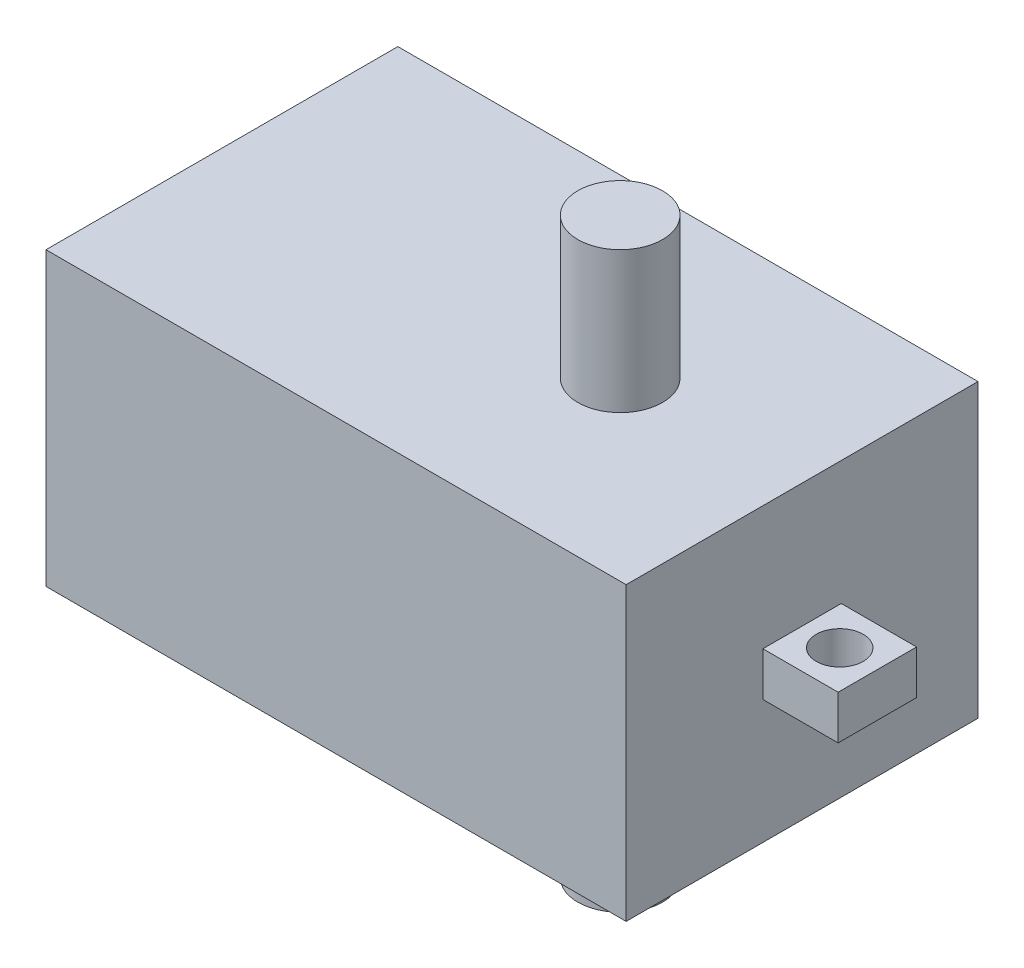
ISO-10303-21;
HEADER;
FILE_DESCRIPTION(('STEP AP214'),'2;1');
FILE_NAME('part.step','',(''),(''),'','','');
FILE_SCHEMA(('AUTOMOTIVE_DESIGN { 1 0 10303 214 1 1 1 1 }'));
ENDSEC;
DATA;
#1=APPLICATION_CONTEXT('core data for automotive mechanical design processes');
#2=APPLICATION_PROTOCOL_DEFINITION('international standard','automotive_design',2000,#1);
#3=PRODUCT_CONTEXT('',#1,'mechanical');
#4=PRODUCT('Part','Part','',(#3));
#5=PRODUCT_RELATED_PRODUCT_CATEGORY('part','',(#4));
#6=PRODUCT_DEFINITION_FORMATION('','',#4);
#7=PRODUCT_DEFINITION_CONTEXT('part definition',#1,'design');
#8=PRODUCT_DEFINITION('design','',#6,#7);
#9=PRODUCT_DEFINITION_SHAPE('','',#8);
#10=(LENGTH_UNIT() NAMED_UNIT(*) SI_UNIT(.MILLI.,.METRE.));
#11=(NAMED_UNIT(*) PLANE_ANGLE_UNIT() SI_UNIT($,.RADIAN.));
#12=(NAMED_UNIT(*) SI_UNIT($,.STERADIAN.) SOLID_ANGLE_UNIT());
#13=UNCERTAINTY_MEASURE_WITH_UNIT(LENGTH_MEASURE(1.E-05),#10,'distance_accuracy_value','');
#14=(GEOMETRIC_REPRESENTATION_CONTEXT(3) GLOBAL_UNCERTAINTY_ASSIGNED_CONTEXT((#13)) GLOBAL_UNIT_ASSIGNED_CONTEXT((#10,
#11,#12)) REPRESENTATION_CONTEXT('',''));
#15=CARTESIAN_POINT('',(0.,0.,0.));
#16=DIRECTION('',(0.,0.,1.));
#17=DIRECTION('',(1.,0.,0.));
#18=AXIS2_PLACEMENT_3D('',#15,#16,#17);
#19=CARTESIAN_POINT('',(18.5,-9.3,22.44));
#20=DIRECTION('',(-1.,0.,0.));
#21=DIRECTION('',(0.,0.,1.));
#22=AXIS2_PLACEMENT_3D('',#19,#20,#21);
#23=PLANE('',#22);
#24=DIRECTION('',(0.,1.,0.));
#25=VECTOR('',#24,1.);
#26=CARTESIAN_POINT('',(18.5,-9.3,0.));
#27=LINE('',#26,#25);
#28=CARTESIAN_POINT('',(18.5,-9.3,0.));
#29=VERTEX_POINT('',#28);
#30=CARTESIAN_POINT('',(18.5,9.3,0.));
#31=VERTEX_POINT('',#30);
#32=EDGE_CURVE('E156',#29,#31,#27,.T.);
#33=ORIENTED_EDGE('',*,*,#32,.T.);
#34=DIRECTION('',(0.,0.,-1.));
#35=VECTOR('',#34,1.);
#36=CARTESIAN_POINT('',(18.5,9.3,22.44));
#37=LINE('',#36,#35);
#38=CARTESIAN_POINT('',(18.5,9.3,22.44));
#39=VERTEX_POINT('',#38);
#40=EDGE_CURVE('E164',#39,#31,#37,.T.);
#41=ORIENTED_EDGE('',*,*,#40,.F.);
#42=DIRECTION('',(0.,1.,0.));
#43=VECTOR('',#42,1.);
#44=CARTESIAN_POINT('',(18.5,-9.3,22.44));
#45=LINE('',#44,#43);
#46=CARTESIAN_POINT('',(18.5,-9.3,22.44));
#47=VERTEX_POINT('',#46);
#48=EDGE_CURVE('E147',#47,#39,#45,.T.);
#49=ORIENTED_EDGE('',*,*,#48,.F.);
#50=DIRECTION('',(0.,0.,-1.));
#51=VECTOR('',#50,1.);
#52=CARTESIAN_POINT('',(18.5,-9.3,22.44));
#53=LINE('',#52,#51);
#54=EDGE_CURVE('E168',#47,#29,#53,.T.);
#55=ORIENTED_EDGE('',*,*,#54,.T.);
#56=EDGE_LOOP('',(#33,#41,#49,#55));
#57=FACE_BOUND('',#56,.T.);
#58=DIRECTION('',(0.,-1.,0.));
#59=VECTOR('',#58,1.);
#60=CARTESIAN_POINT('',(18.5,-1.4,13.72));
#61=LINE('',#60,#59);
#62=CARTESIAN_POINT('',(18.5,1.4,13.72));
#63=VERTEX_POINT('',#62);
#64=CARTESIAN_POINT('',(18.5,-1.4,13.72));
#65=VERTEX_POINT('',#64);
#66=EDGE_CURVE('E55',#63,#65,#61,.T.);
#67=ORIENTED_EDGE('',*,*,#66,.F.);
#68=DIRECTION('',(0.,0.,1.));
#69=VECTOR('',#68,1.);
#70=CARTESIAN_POINT('',(18.5,1.4,8.72));
#71=LINE('',#70,#69);
#72=CARTESIAN_POINT('',(18.5,1.4,8.72));
#73=VERTEX_POINT('',#72);
#74=EDGE_CURVE('E59',#73,#63,#71,.T.);
#75=ORIENTED_EDGE('',*,*,#74,.F.);
#76=DIRECTION('',(0.,1.,0.));
#77=VECTOR('',#76,1.);
#78=CARTESIAN_POINT('',(18.5,-1.4,8.72));
#79=LINE('',#78,#77);
#80=CARTESIAN_POINT('',(18.5,-1.4,8.72));
#81=VERTEX_POINT('',#80);
#82=EDGE_CURVE('E250',#81,#73,#79,.T.);
#83=ORIENTED_EDGE('',*,*,#82,.F.);
#84=DIRECTION('',(0.,0.,-1.));
#85=VECTOR('',#84,1.);
#86=CARTESIAN_POINT('',(18.5,-1.4,8.72));
#87=LINE('',#86,#85);
#88=EDGE_CURVE('E247',#65,#81,#87,.T.);
#89=ORIENTED_EDGE('',*,*,#88,.F.);
#90=EDGE_LOOP('',(#67,#75,#83,#89));
#91=FACE_BOUND('',#90,.T.);
#92=ADVANCED_FACE('F39',(#57,#91),#23,.F.);
#93=CARTESIAN_POINT('',(-18.5,-9.3,22.44));
#94=DIRECTION('',(1.,0.,0.));
#95=DIRECTION('',(0.,0.,-1.));
#96=AXIS2_PLACEMENT_3D('',#93,#94,#95);
#97=PLANE('',#96);
#98=DIRECTION('',(0.,-1.,0.));
#99=VECTOR('',#98,1.);
#100=CARTESIAN_POINT('',(-18.5,-9.3,0.));
#101=LINE('',#100,#99);
#102=CARTESIAN_POINT('',(-18.5,9.3,0.));
#103=VERTEX_POINT('',#102);
#104=CARTESIAN_POINT('',(-18.5,-9.3,0.));
#105=VERTEX_POINT('',#104);
#106=EDGE_CURVE('E128',#103,#105,#101,.T.);
#107=ORIENTED_EDGE('',*,*,#106,.T.);
#108=DIRECTION('',(0.,0.,-1.));
#109=VECTOR('',#108,1.);
#110=CARTESIAN_POINT('',(-18.5,-9.3,22.44));
#111=LINE('',#110,#109);
#112=CARTESIAN_POINT('',(-18.5,-9.3,22.44));
#113=VERTEX_POINT('',#112);
#114=EDGE_CURVE('E48',#113,#105,#111,.T.);
#115=ORIENTED_EDGE('',*,*,#114,.F.);
#116=DIRECTION('',(0.,-1.,0.));
#117=VECTOR('',#116,1.);
#118=CARTESIAN_POINT('',(-18.5,-9.3,22.44));
#119=LINE('',#118,#117);
#120=CARTESIAN_POINT('',(-18.5,9.3,22.44));
#121=VERTEX_POINT('',#120);
#122=EDGE_CURVE('E139',#121,#113,#119,.T.);
#123=ORIENTED_EDGE('',*,*,#122,.F.);
#124=DIRECTION('',(0.,0.,-1.));
#125=VECTOR('',#124,1.);
#126=CARTESIAN_POINT('',(-18.5,9.3,22.44));
#127=LINE('',#126,#125);
#128=EDGE_CURVE('E152',#121,#103,#127,.T.);
#129=ORIENTED_EDGE('',*,*,#128,.T.);
#130=EDGE_LOOP('',(#107,#115,#123,#129));
#131=FACE_BOUND('',#130,.T.);
#132=ADVANCED_FACE('F41',(#131),#97,.F.);
#133=CARTESIAN_POINT('',(18.5,-9.3,22.44));
#134=DIRECTION('',(0.,1.,0.));
#135=DIRECTION('',(-1.,0.,0.));
#136=AXIS2_PLACEMENT_3D('',#133,#134,#135);
#137=PLANE('',#136);
#138=CARTESIAN_POINT('',(6.9,-9.3,11.22));
#139=DIRECTION('',(0.,1.,0.));
#140=DIRECTION('',(-1.,0.,0.));
#141=AXIS2_PLACEMENT_3D('',#138,#139,#140);
#142=CIRCLE('',#141,2.7);
#143=CARTESIAN_POINT('',(4.2,-9.3,11.22));
#144=VERTEX_POINT('',#143);
#145=EDGE_CURVE('E219',#144,#144,#142,.T.);
#146=ORIENTED_EDGE('',*,*,#145,.T.);
#147=EDGE_LOOP('',(#146));
#148=FACE_BOUND('',#147,.T.);
#149=DIRECTION('',(1.,0.,0.));
#150=VECTOR('',#149,1.);
#151=CARTESIAN_POINT('',(18.5,-9.3,0.));
#152=LINE('',#151,#150);
#153=EDGE_CURVE('E133',#105,#29,#152,.T.);
#154=ORIENTED_EDGE('',*,*,#153,.T.);
#155=ORIENTED_EDGE('',*,*,#54,.F.);
#156=DIRECTION('',(1.,0.,0.));
#157=VECTOR('',#156,1.);
#158=CARTESIAN_POINT('',(18.5,-9.3,22.44));
#159=LINE('',#158,#157);
#160=EDGE_CURVE('E143',#113,#47,#159,.T.);
#161=ORIENTED_EDGE('',*,*,#160,.F.);
#162=ORIENTED_EDGE('',*,*,#114,.T.);
#163=EDGE_LOOP('',(#154,#155,#161,#162));
#164=FACE_BOUND('',#163,.T.);
#165=ADVANCED_FACE('F175',(#148,#164),#137,.F.);
#166=CARTESIAN_POINT('',(18.5,9.3,22.44));
#167=DIRECTION('',(0.,-1.,0.));
#168=DIRECTION('',(1.,0.,0.));
#169=AXIS2_PLACEMENT_3D('',#166,#167,#168);
#170=PLANE('',#169);
#171=CARTESIAN_POINT('',(6.9,9.3,11.22));
#172=DIRECTION('',(0.,-1.,0.));
#173=DIRECTION('',(1.,0.,0.));
#174=AXIS2_PLACEMENT_3D('',#171,#172,#173);
#175=CIRCLE('',#174,2.7);
#176=CARTESIAN_POINT('',(9.6,9.3,11.22));
#177=VERTEX_POINT('',#176);
#178=EDGE_CURVE('E11',#177,#177,#175,.F.);
#179=ORIENTED_EDGE('',*,*,#178,.F.);
#180=EDGE_LOOP('',(#179));
#181=FACE_BOUND('',#180,.T.);
#182=DIRECTION('',(-1.,0.,0.));
#183=VECTOR('',#182,1.);
#184=CARTESIAN_POINT('',(18.5,9.3,0.));
#185=LINE('',#184,#183);
#186=EDGE_CURVE('E144',#31,#103,#185,.T.);
#187=ORIENTED_EDGE('',*,*,#186,.T.);
#188=ORIENTED_EDGE('',*,*,#128,.F.);
#189=DIRECTION('',(-1.,0.,0.));
#190=VECTOR('',#189,1.);
#191=CARTESIAN_POINT('',(18.5,9.3,22.44));
#192=LINE('',#191,#190);
#193=EDGE_CURVE('E150',#39,#121,#192,.T.);
#194=ORIENTED_EDGE('',*,*,#193,.F.);
#195=ORIENTED_EDGE('',*,*,#40,.T.);
#196=EDGE_LOOP('',(#187,#188,#194,#195));
#197=FACE_BOUND('',#196,.T.);
#198=ADVANCED_FACE('F190',(#181,#197),#170,.F.);
#199=CARTESIAN_POINT('',(0.,0.,22.44));
#200=DIRECTION('',(0.,0.,1.));
#201=DIRECTION('',(1.,0.,0.));
#202=AXIS2_PLACEMENT_3D('',#199,#200,#201);
#203=PLANE('',#202);
#204=ORIENTED_EDGE('',*,*,#122,.T.);
#205=ORIENTED_EDGE('',*,*,#160,.T.);
#206=ORIENTED_EDGE('',*,*,#48,.T.);
#207=ORIENTED_EDGE('',*,*,#193,.T.);
#208=EDGE_LOOP('',(#204,#205,#206,#207));
#209=FACE_BOUND('',#208,.T.);
#210=ADVANCED_FACE('F192',(#209),#203,.T.);
#211=CARTESIAN_POINT('',(0.,0.,0.));
#212=DIRECTION('',(0.,0.,1.));
#213=DIRECTION('',(1.,0.,0.));
#214=AXIS2_PLACEMENT_3D('',#211,#212,#213);
#215=PLANE('',#214);
#216=ORIENTED_EDGE('',*,*,#106,.F.);
#217=ORIENTED_EDGE('',*,*,#186,.F.);
#218=ORIENTED_EDGE('',*,*,#32,.F.);
#219=ORIENTED_EDGE('',*,*,#153,.F.);
#220=EDGE_LOOP('',(#216,#217,#218,#219));
#221=FACE_BOUND('',#220,.T.);
#222=ADVANCED_FACE('F183',(#221),#215,.F.);
#223=CARTESIAN_POINT('',(23.3,-1.4,13.72));
#224=DIRECTION('',(0.,0.,-1.));
#225=DIRECTION('',(-1.,0.,0.));
#226=AXIS2_PLACEMENT_3D('',#223,#224,#225);
#227=PLANE('',#226);
#228=ORIENTED_EDGE('',*,*,#66,.T.);
#229=DIRECTION('',(-1.,0.,0.));
#230=VECTOR('',#229,1.);
#231=CARTESIAN_POINT('',(23.3,-1.4,13.72));
#232=LINE('',#231,#230);
#233=CARTESIAN_POINT('',(23.3,-1.4,13.72));
#234=VERTEX_POINT('',#233);
#235=EDGE_CURVE('E108',#234,#65,#232,.T.);
#236=ORIENTED_EDGE('',*,*,#235,.F.);
#237=DIRECTION('',(0.,-1.,0.));
#238=VECTOR('',#237,1.);
#239=CARTESIAN_POINT('',(23.3,-1.4,13.72));
#240=LINE('',#239,#238);
#241=CARTESIAN_POINT('',(23.3,1.4,13.72));
#242=VERTEX_POINT('',#241);
#243=EDGE_CURVE('E115',#242,#234,#240,.T.);
#244=ORIENTED_EDGE('',*,*,#243,.F.);
#245=DIRECTION('',(-1.,0.,0.));
#246=VECTOR('',#245,1.);
#247=CARTESIAN_POINT('',(23.3,1.4,13.72));
#248=LINE('',#247,#246);
#249=EDGE_CURVE('E244',#242,#63,#248,.T.);
#250=ORIENTED_EDGE('',*,*,#249,.T.);
#251=EDGE_LOOP('',(#228,#236,#244,#250));
#252=FACE_BOUND('',#251,.T.);
#253=ADVANCED_FACE('F126',(#252),#227,.F.);
#254=CARTESIAN_POINT('',(23.3,-1.4,8.72));
#255=DIRECTION('',(0.,1.,0.));
#256=DIRECTION('',(0.,0.,1.));
#257=AXIS2_PLACEMENT_3D('',#254,#255,#256);
#258=PLANE('',#257);
#259=CARTESIAN_POINT('',(20.9,-1.4,11.22));
#260=DIRECTION('',(0.,1.,0.));
#261=DIRECTION('',(0.,0.,1.));
#262=AXIS2_PLACEMENT_3D('',#259,#260,#261);
#263=CIRCLE('',#262,1.5);
#264=CARTESIAN_POINT('',(20.9,-1.4,12.72));
#265=VERTEX_POINT('',#264);
#266=EDGE_CURVE('E236',#265,#265,#263,.F.);
#267=ORIENTED_EDGE('',*,*,#266,.F.);
#268=EDGE_LOOP('',(#267));
#269=FACE_BOUND('',#268,.T.);
#270=ORIENTED_EDGE('',*,*,#88,.T.);
#271=DIRECTION('',(-1.,0.,0.));
#272=VECTOR('',#271,1.);
#273=CARTESIAN_POINT('',(23.3,-1.4,8.72));
#274=LINE('',#273,#272);
#275=CARTESIAN_POINT('',(23.3,-1.4,8.72));
#276=VERTEX_POINT('',#275);
#277=EDGE_CURVE('E110',#276,#81,#274,.T.);
#278=ORIENTED_EDGE('',*,*,#277,.F.);
#279=DIRECTION('',(0.,0.,-1.));
#280=VECTOR('',#279,1.);
#281=CARTESIAN_POINT('',(23.3,-1.4,8.72));
#282=LINE('',#281,#280);
#283=EDGE_CURVE('E103',#234,#276,#282,.T.);
#284=ORIENTED_EDGE('',*,*,#283,.F.);
#285=ORIENTED_EDGE('',*,*,#235,.T.);
#286=EDGE_LOOP('',(#270,#278,#284,#285));
#287=FACE_BOUND('',#286,.T.);
#288=ADVANCED_FACE('F106',(#269,#287),#258,.F.);
#289=CARTESIAN_POINT('',(23.3,-1.4,8.72));
#290=DIRECTION('',(0.,0.,1.));
#291=DIRECTION('',(1.,0.,0.));
#292=AXIS2_PLACEMENT_3D('',#289,#290,#291);
#293=PLANE('',#292);
#294=ORIENTED_EDGE('',*,*,#82,.T.);
#295=DIRECTION('',(-1.,0.,0.));
#296=VECTOR('',#295,1.);
#297=CARTESIAN_POINT('',(23.3,1.4,8.72));
#298=LINE('',#297,#296);
#299=CARTESIAN_POINT('',(23.3,1.4,8.72));
#300=VERTEX_POINT('',#299);
#301=EDGE_CURVE('E135',#300,#73,#298,.T.);
#302=ORIENTED_EDGE('',*,*,#301,.F.);
#303=DIRECTION('',(0.,1.,0.));
#304=VECTOR('',#303,1.);
#305=CARTESIAN_POINT('',(23.3,-1.4,8.72));
#306=LINE('',#305,#304);
#307=EDGE_CURVE('E114',#276,#300,#306,.T.);
#308=ORIENTED_EDGE('',*,*,#307,.F.);
#309=ORIENTED_EDGE('',*,*,#277,.T.);
#310=EDGE_LOOP('',(#294,#302,#308,#309));
#311=FACE_BOUND('',#310,.T.);
#312=ADVANCED_FACE('F262',(#311),#293,.F.);
#313=CARTESIAN_POINT('',(23.3,1.4,8.72));
#314=DIRECTION('',(0.,-1.,0.));
#315=DIRECTION('',(0.,0.,-1.));
#316=AXIS2_PLACEMENT_3D('',#313,#314,#315);
#317=PLANE('',#316);
#318=CARTESIAN_POINT('',(20.9,1.4,11.22));
#319=DIRECTION('',(0.,1.,0.));
#320=DIRECTION('',(0.,0.,1.));
#321=AXIS2_PLACEMENT_3D('',#318,#319,#320);
#322=CIRCLE('',#321,1.5);
#323=CARTESIAN_POINT('',(20.9,1.40000000000001,12.72));
#324=VERTEX_POINT('',#323);
#325=EDGE_CURVE('E232',#324,#324,#322,.T.);
#326=ORIENTED_EDGE('',*,*,#325,.F.);
#327=EDGE_LOOP('',(#326));
#328=FACE_BOUND('',#327,.T.);
#329=ORIENTED_EDGE('',*,*,#74,.T.);
#330=ORIENTED_EDGE('',*,*,#249,.F.);
#331=DIRECTION('',(0.,0.,1.));
#332=VECTOR('',#331,1.);
#333=CARTESIAN_POINT('',(23.3,1.4,8.72));
#334=LINE('',#333,#332);
#335=EDGE_CURVE('E120',#300,#242,#334,.T.);
#336=ORIENTED_EDGE('',*,*,#335,.F.);
#337=ORIENTED_EDGE('',*,*,#301,.T.);
#338=EDGE_LOOP('',(#329,#330,#336,#337));
#339=FACE_BOUND('',#338,.T.);
#340=ADVANCED_FACE('F260',(#328,#339),#317,.F.);
#341=CARTESIAN_POINT('',(23.3,0.,0.));
#342=DIRECTION('',(1.,0.,0.));
#343=DIRECTION('',(0.,0.,-1.));
#344=AXIS2_PLACEMENT_3D('',#341,#342,#343);
#345=PLANE('',#344);
#346=ORIENTED_EDGE('',*,*,#243,.T.);
#347=ORIENTED_EDGE('',*,*,#283,.T.);
#348=ORIENTED_EDGE('',*,*,#307,.T.);
#349=ORIENTED_EDGE('',*,*,#335,.T.);
#350=EDGE_LOOP('',(#346,#347,#348,#349));
#351=FACE_BOUND('',#350,.T.);
#352=ADVANCED_FACE('F118',(#351),#345,.T.);
#353=CARTESIAN_POINT('',(20.9,-9.30100000000001,11.22));
#354=DIRECTION('',(0.,1.,0.));
#355=DIRECTION('',(0.,0.,1.));
#356=AXIS2_PLACEMENT_3D('',#353,#354,#355);
#357=CYLINDRICAL_SURFACE('',#356,1.5);
#358=CARTESIAN_POINT('',(20.9,1.40000000000001,12.72));
#359=CARTESIAN_POINT('',(20.9,1.37083333333334,12.72));
#360=CARTESIAN_POINT('',(20.9,1.34166666666667,12.72));
#361=CARTESIAN_POINT('',(20.9,1.28333333333334,12.72));
#362=CARTESIAN_POINT('',(20.9,1.25416666666667,12.72));
#363=CARTESIAN_POINT('',(20.9,1.19583333333334,12.72));
#364=CARTESIAN_POINT('',(20.9,1.16666666666667,12.72));
#365=CARTESIAN_POINT('',(20.9,1.10833333333334,12.72));
#366=CARTESIAN_POINT('',(20.9,1.07916666666667,12.72));
#367=CARTESIAN_POINT('',(20.9,1.02083333333334,12.72));
#368=CARTESIAN_POINT('',(20.9,0.991666666666672,12.72));
#369=CARTESIAN_POINT('',(20.9,0.933333333333338,12.72));
#370=CARTESIAN_POINT('',(20.9,0.904166666666671,12.72));
#371=CARTESIAN_POINT('',(20.9,0.845833333333338,12.72));
#372=CARTESIAN_POINT('',(20.9,0.816666666666672,12.72));
#373=CARTESIAN_POINT('',(20.9,0.758333333333338,12.72));
#374=CARTESIAN_POINT('',(20.9,0.729166666666671,12.72));
#375=CARTESIAN_POINT('',(20.9,0.670833333333338,12.72));
#376=CARTESIAN_POINT('',(20.9,0.641666666666671,12.72));
#377=CARTESIAN_POINT('',(20.9,0.583333333333337,12.72));
#378=CARTESIAN_POINT('',(20.9,0.554166666666671,12.72));
#379=CARTESIAN_POINT('',(20.9,0.495833333333338,12.72));
#380=CARTESIAN_POINT('',(20.9,0.466666666666671,12.72));
#381=CARTESIAN_POINT('',(20.9,0.408333333333337,12.72));
#382=CARTESIAN_POINT('',(20.9,0.37916666666667,12.72));
#383=CARTESIAN_POINT('',(20.9,0.320833333333337,12.72));
#384=CARTESIAN_POINT('',(20.9,0.29166666666667,12.72));
#385=CARTESIAN_POINT('',(20.9,0.233333333333337,12.72));
#386=CARTESIAN_POINT('',(20.9,0.20416666666667,12.72));
#387=CARTESIAN_POINT('',(20.9,0.145833333333337,12.72));
#388=CARTESIAN_POINT('',(20.9,0.116666666666671,12.72));
#389=CARTESIAN_POINT('',(20.9,0.0583333333333373,12.72));
#390=CARTESIAN_POINT('',(20.9,0.0291666666666704,12.72));
#391=CARTESIAN_POINT('',(20.9,-0.0291666666666635,12.72));
#392=CARTESIAN_POINT('',(20.9,-0.0583333333333304,12.72));
#393=CARTESIAN_POINT('',(20.9,-0.116666666666664,12.72));
#394=CARTESIAN_POINT('',(20.9,-0.14583333333333,12.72));
#395=CARTESIAN_POINT('',(20.9,-0.204166666666663,12.72));
#396=CARTESIAN_POINT('',(20.9,-0.23333333333333,12.72));
#397=CARTESIAN_POINT('',(20.9,-0.291666666666663,12.72));
#398=CARTESIAN_POINT('',(20.9,-0.32083333333333,12.72));
#399=CARTESIAN_POINT('',(20.9,-0.379166666666663,12.72));
#400=CARTESIAN_POINT('',(20.9,-0.40833333333333,12.72));
#401=CARTESIAN_POINT('',(20.9,-0.466666666666664,12.72));
#402=CARTESIAN_POINT('',(20.9,-0.495833333333331,12.72));
#403=CARTESIAN_POINT('',(20.9,-0.554166666666665,12.72));
#404=CARTESIAN_POINT('',(20.9,-0.583333333333331,12.72));
#405=CARTESIAN_POINT('',(20.9,-0.641666666666665,12.72));
#406=CARTESIAN_POINT('',(20.9,-0.670833333333331,12.72));
#407=CARTESIAN_POINT('',(20.9,-0.729166666666664,12.72));
#408=CARTESIAN_POINT('',(20.9,-0.75833333333333,12.72));
#409=CARTESIAN_POINT('',(20.9,-0.816666666666663,12.72));
#410=CARTESIAN_POINT('',(20.9,-0.84583333333333,12.72));
#411=CARTESIAN_POINT('',(20.9,-0.904166666666664,12.72));
#412=CARTESIAN_POINT('',(20.9,-0.933333333333331,12.72));
#413=CARTESIAN_POINT('',(20.9,-0.991666666666665,12.72));
#414=CARTESIAN_POINT('',(20.9,-1.02083333333333,12.72));
#415=CARTESIAN_POINT('',(20.9,-1.07916666666667,12.72));
#416=CARTESIAN_POINT('',(20.9,-1.10833333333333,12.72));
#417=CARTESIAN_POINT('',(20.9,-1.16666666666666,12.72));
#418=CARTESIAN_POINT('',(20.9,-1.19583333333333,12.72));
#419=CARTESIAN_POINT('',(20.9,-1.25416666666666,12.72));
#420=CARTESIAN_POINT('',(20.9,-1.28333333333333,12.72));
#421=CARTESIAN_POINT('',(20.9,-1.34166666666666,12.72));
#422=CARTESIAN_POINT('',(20.9,-1.37083333333333,12.72));
#423=CARTESIAN_POINT('',(20.9,-1.4,12.72));
#424=B_SPLINE_CURVE_WITH_KNOTS('',3,(#358,#359,#360,#361,#362,#363,#364,#365,#366,#367,#368,
#369,#370,#371,#372,#373,#374,#375,#376,#377,#378,#379,#380,#381,#382,#383,#384,#385,#386,#387,
#388,#389,#390,#391,#392,#393,#394,#395,#396,#397,#398,#399,#400,#401,#402,#403,#404,#405,#406,
#407,#408,#409,#410,#411,#412,#413,#414,#415,#416,#417,#418,#419,#420,#421,#422,#423),
.UNSPECIFIED.,.F.,.F.,(4,2,2,2,2,2,2,2,2,2,2,2,2,2,2,2,2,2,2,2,2,2,2,2,2,2,2,2,2,2,2,2,4),(0.,
0.0875000000000008,0.175,0.262500000000001,0.35,0.4375,0.525000000000001,0.6125,
0.700000000000001,0.787500000000002,0.875000000000001,0.962500000000002,1.05,1.1375,1.225,
1.3125,1.4,1.4875,1.575,1.6625,1.75,1.8375,1.925,2.0125,2.1,2.1875,2.275,2.3625,2.45,2.5375,
2.625,2.7125,2.8),.UNSPECIFIED.);
#425=EDGE_CURVE('BSEAM298',#324,#265,#424,.T.);
#426=ORIENTED_EDGE('',*,*,#325,.T.);
#427=ORIENTED_EDGE('',*,*,#266,.T.);
#428=ORIENTED_EDGE('',*,*,#425,.T.);
#429=ORIENTED_EDGE('',*,*,#425,.F.);
#430=EDGE_LOOP('',(#426,#428,#427,#429));
#431=FACE_BOUND('',#430,.T.);
#432=ADVANCED_FACE('F298',(#431),#357,.F.);
#433=CARTESIAN_POINT('',(6.9,18.3,11.22));
#434=DIRECTION('',(0.,-1.,0.));
#435=DIRECTION('',(1.,0.,0.));
#436=AXIS2_PLACEMENT_3D('',#433,#434,#435);
#437=CYLINDRICAL_SURFACE('',#436,2.7);
#438=CARTESIAN_POINT('',(6.9,18.3,11.22));
#439=DIRECTION('',(0.,1.,0.));
#440=DIRECTION('',(-1.,0.,0.));
#441=AXIS2_PLACEMENT_3D('',#438,#439,#440);
#442=CIRCLE('',#441,2.7);
#443=CARTESIAN_POINT('',(4.2,18.3,11.22));
#444=VERTEX_POINT('',#443);
#445=EDGE_CURVE('E226',#444,#444,#442,.T.);
#446=ORIENTED_EDGE('',*,*,#445,.F.);
#447=EDGE_LOOP('',(#446));
#448=FACE_BOUND('',#447,.T.);
#449=ORIENTED_EDGE('',*,*,#178,.T.);
#450=EDGE_LOOP('',(#449));
#451=FACE_BOUND('',#450,.T.);
#452=ADVANCED_FACE('F302',(#448,#451),#437,.T.);
#453=CARTESIAN_POINT('',(6.9,18.3,11.22));
#454=DIRECTION('',(0.,1.,0.));
#455=DIRECTION('',(-1.,0.,0.));
#456=AXIS2_PLACEMENT_3D('',#453,#454,#455);
#457=PLANE('',#456);
#458=ORIENTED_EDGE('',*,*,#445,.T.);
#459=EDGE_LOOP('',(#458));
#460=FACE_BOUND('',#459,.T.);
#461=ADVANCED_FACE('F315',(#460),#457,.T.);
#462=CARTESIAN_POINT('',(6.9,-18.3,11.22));
#463=DIRECTION('',(0.,1.,0.));
#464=DIRECTION('',(-1.,0.,0.));
#465=AXIS2_PLACEMENT_3D('',#462,#463,#464);
#466=CYLINDRICAL_SURFACE('',#465,2.7);
#467=CARTESIAN_POINT('',(6.9,-18.3,11.22));
#468=DIRECTION('',(0.,1.,0.));
#469=DIRECTION('',(-1.,0.,0.));
#470=AXIS2_PLACEMENT_3D('',#467,#468,#469);
#471=CIRCLE('',#470,2.7);
#472=CARTESIAN_POINT('',(4.2,-18.3,11.22));
#473=VERTEX_POINT('',#472);
#474=EDGE_CURVE('E222',#473,#473,#471,.T.);
#475=ORIENTED_EDGE('',*,*,#474,.T.);
#476=EDGE_LOOP('',(#475));
#477=FACE_BOUND('',#476,.T.);
#478=ORIENTED_EDGE('',*,*,#145,.F.);
#479=EDGE_LOOP('',(#478));
#480=FACE_BOUND('',#479,.T.);
#481=ADVANCED_FACE('F324',(#477,#480),#466,.T.);
#482=CARTESIAN_POINT('',(6.9,-18.3,11.22));
#483=DIRECTION('',(0.,-1.,0.));
#484=DIRECTION('',(-1.,0.,0.));
#485=AXIS2_PLACEMENT_3D('',#482,#483,#484);
#486=PLANE('',#485);
#487=ORIENTED_EDGE('',*,*,#474,.F.);
#488=EDGE_LOOP('',(#487));
#489=FACE_BOUND('',#488,.T.);
#490=ADVANCED_FACE('F334',(#489),#486,.T.);
#491=CLOSED_SHELL('',(#92,#132,#165,#198,#210,#222,#253,#288,#312,#340,#352,#432,#452,#461,#481,#490));
#492=MANIFOLD_SOLID_BREP('B2',#491);
#493=ADVANCED_BREP_SHAPE_REPRESENTATION('',(#18,#492),#14);
#494=SHAPE_DEFINITION_REPRESENTATION(#9,#493);
ENDSEC;
END-ISO-10303-21;
